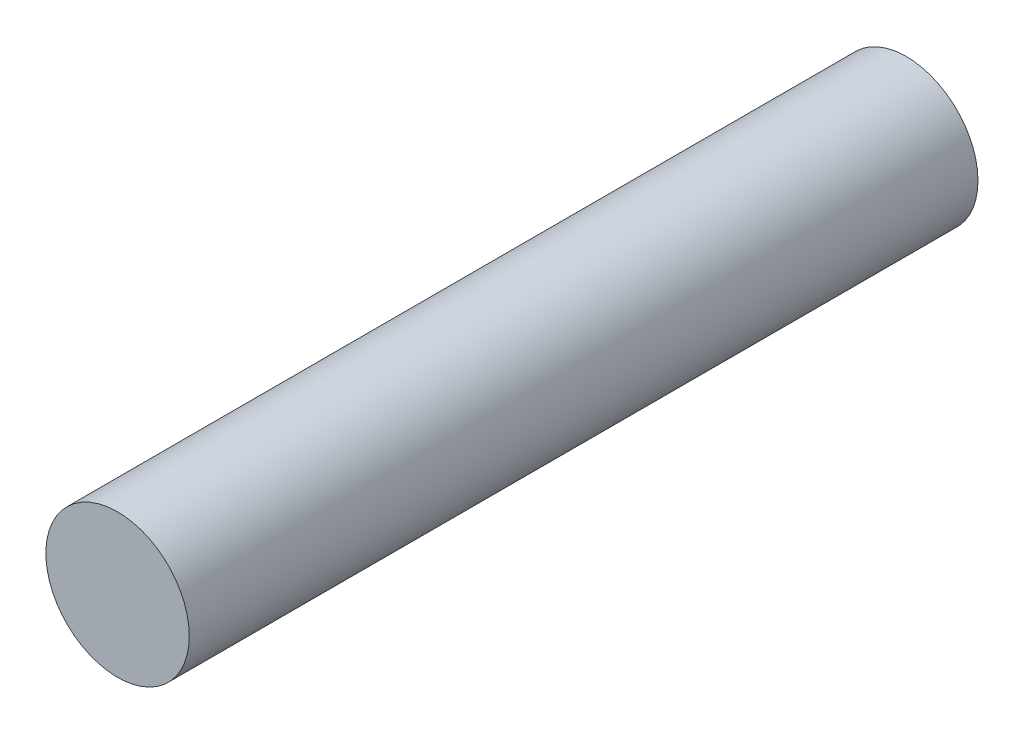
ISO-10303-21;
HEADER;
FILE_DESCRIPTION(('STEP AP214'),'2;1');
FILE_NAME('part.step','',(''),(''),'','','');
FILE_SCHEMA(('AUTOMOTIVE_DESIGN { 1 0 10303 214 1 1 1 1 }'));
ENDSEC;
DATA;
#1=APPLICATION_CONTEXT('core data for automotive mechanical design processes');
#2=APPLICATION_PROTOCOL_DEFINITION('international standard','automotive_design',2000,#1);
#3=PRODUCT_CONTEXT('',#1,'mechanical');
#4=PRODUCT('Part','Part','',(#3));
#5=PRODUCT_RELATED_PRODUCT_CATEGORY('part','',(#4));
#6=PRODUCT_DEFINITION_FORMATION('','',#4);
#7=PRODUCT_DEFINITION_CONTEXT('part definition',#1,'design');
#8=PRODUCT_DEFINITION('design','',#6,#7);
#9=PRODUCT_DEFINITION_SHAPE('','',#8);
#10=(LENGTH_UNIT() NAMED_UNIT(*) SI_UNIT(.MILLI.,.METRE.));
#11=(NAMED_UNIT(*) PLANE_ANGLE_UNIT() SI_UNIT($,.RADIAN.));
#12=(NAMED_UNIT(*) SI_UNIT($,.STERADIAN.) SOLID_ANGLE_UNIT());
#13=UNCERTAINTY_MEASURE_WITH_UNIT(LENGTH_MEASURE(1.E-05),#10,'distance_accuracy_value','');
#14=(GEOMETRIC_REPRESENTATION_CONTEXT(3) GLOBAL_UNCERTAINTY_ASSIGNED_CONTEXT((#13)) GLOBAL_UNIT_ASSIGNED_CONTEXT((#10,
#11,#12)) REPRESENTATION_CONTEXT('',''));
#15=CARTESIAN_POINT('',(0.,0.,0.));
#16=DIRECTION('',(0.,0.,1.));
#17=DIRECTION('',(1.,0.,0.));
#18=AXIS2_PLACEMENT_3D('',#15,#16,#17);
#19=CARTESIAN_POINT('',(0.,0.,110.));
#20=DIRECTION('',(0.,0.,-1.));
#21=DIRECTION('',(-1.,0.,0.));
#22=AXIS2_PLACEMENT_3D('',#19,#20,#21);
#23=CYLINDRICAL_SURFACE('',#22,10.);
#24=CARTESIAN_POINT('',(0.,0.,110.));
#25=DIRECTION('',(0.,0.,1.));
#26=DIRECTION('',(1.,0.,0.));
#27=AXIS2_PLACEMENT_3D('',#24,#25,#26);
#28=CIRCLE('',#27,10.);
#29=CARTESIAN_POINT('',(10.,0.,110.));
#30=VERTEX_POINT('',#29);
#31=EDGE_CURVE('E10',#30,#30,#28,.T.);
#32=ORIENTED_EDGE('',*,*,#31,.F.);
#33=EDGE_LOOP('',(#32));
#34=FACE_BOUND('',#33,.T.);
#35=CARTESIAN_POINT('',(0.,0.,0.));
#36=DIRECTION('',(0.,0.,1.));
#37=DIRECTION('',(1.,0.,0.));
#38=AXIS2_PLACEMENT_3D('',#35,#36,#37);
#39=CIRCLE('',#38,10.);
#40=CARTESIAN_POINT('',(10.,0.,0.));
#41=VERTEX_POINT('',#40);
#42=EDGE_CURVE('E42',#41,#41,#39,.T.);
#43=ORIENTED_EDGE('',*,*,#42,.T.);
#44=EDGE_LOOP('',(#43));
#45=FACE_BOUND('',#44,.T.);
#46=ADVANCED_FACE('F39',(#34,#45),#23,.T.);
#47=CARTESIAN_POINT('',(0.,0.,110.));
#48=DIRECTION('',(0.,0.,1.));
#49=DIRECTION('',(1.,0.,0.));
#50=AXIS2_PLACEMENT_3D('',#47,#48,#49);
#51=PLANE('',#50);
#52=ORIENTED_EDGE('',*,*,#31,.T.);
#53=EDGE_LOOP('',(#52));
#54=FACE_BOUND('',#53,.T.);
#55=ADVANCED_FACE('F56',(#54),#51,.T.);
#56=CARTESIAN_POINT('',(0.,0.,0.));
#57=DIRECTION('',(0.,0.,1.));
#58=DIRECTION('',(1.,0.,0.));
#59=AXIS2_PLACEMENT_3D('',#56,#57,#58);
#60=PLANE('',#59);
#61=ORIENTED_EDGE('',*,*,#42,.F.);
#62=EDGE_LOOP('',(#61));
#63=FACE_BOUND('',#62,.T.);
#64=ADVANCED_FACE('F54',(#63),#60,.F.);
#65=CLOSED_SHELL('',(#46,#55,#64));
#66=MANIFOLD_SOLID_BREP('B2',#65);
#67=ADVANCED_BREP_SHAPE_REPRESENTATION('',(#18,#66),#14);
#68=SHAPE_DEFINITION_REPRESENTATION(#9,#67);
ENDSEC;
END-ISO-10303-21;
